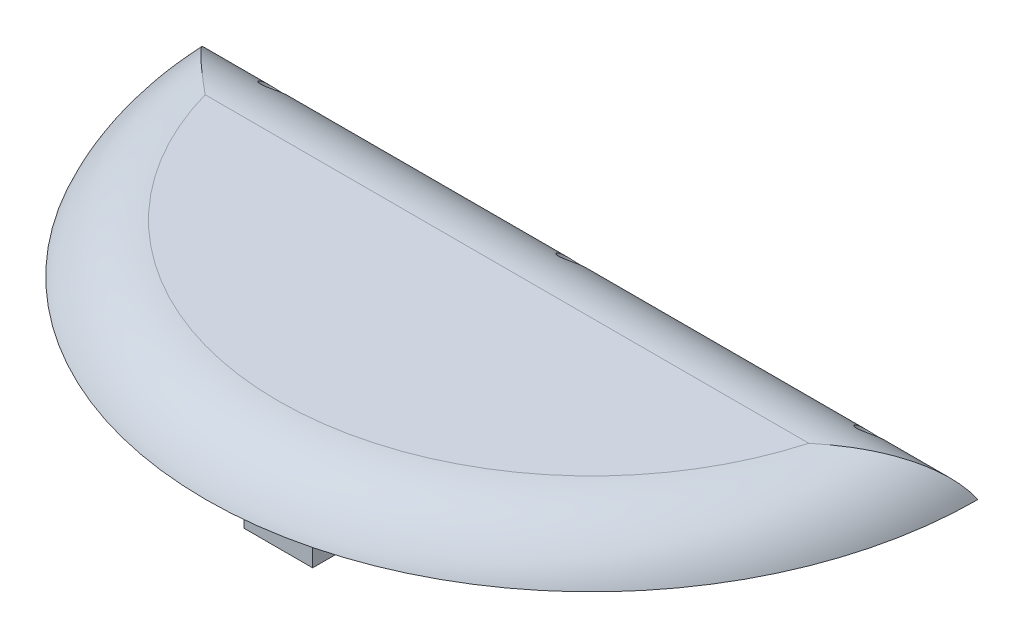
ISO-10303-21;
HEADER;
FILE_DESCRIPTION(('STEP AP214'),'2;1');
FILE_NAME('part.step','',(''),(''),'','','');
FILE_SCHEMA(('AUTOMOTIVE_DESIGN { 1 0 10303 214 1 1 1 1 }'));
ENDSEC;
DATA;
#1=APPLICATION_CONTEXT('core data for automotive mechanical design processes');
#2=APPLICATION_PROTOCOL_DEFINITION('international standard','automotive_design',2000,#1);
#3=PRODUCT_CONTEXT('',#1,'mechanical');
#4=PRODUCT('Part','Part','',(#3));
#5=PRODUCT_RELATED_PRODUCT_CATEGORY('part','',(#4));
#6=PRODUCT_DEFINITION_FORMATION('','',#4);
#7=PRODUCT_DEFINITION_CONTEXT('part definition',#1,'design');
#8=PRODUCT_DEFINITION('design','',#6,#7);
#9=PRODUCT_DEFINITION_SHAPE('','',#8);
#10=(LENGTH_UNIT() NAMED_UNIT(*) SI_UNIT(.MILLI.,.METRE.));
#11=(NAMED_UNIT(*) PLANE_ANGLE_UNIT() SI_UNIT($,.RADIAN.));
#12=(NAMED_UNIT(*) SI_UNIT($,.STERADIAN.) SOLID_ANGLE_UNIT());
#13=UNCERTAINTY_MEASURE_WITH_UNIT(LENGTH_MEASURE(1.E-05),#10,'distance_accuracy_value','');
#14=(GEOMETRIC_REPRESENTATION_CONTEXT(3) GLOBAL_UNCERTAINTY_ASSIGNED_CONTEXT((#13)) GLOBAL_UNIT_ASSIGNED_CONTEXT((#10,
#11,#12)) REPRESENTATION_CONTEXT('',''));
#15=CARTESIAN_POINT('',(0.,0.,0.));
#16=DIRECTION('',(0.,0.,1.));
#17=DIRECTION('',(1.,0.,0.));
#18=AXIS2_PLACEMENT_3D('',#15,#16,#17);
#19=CARTESIAN_POINT('',(0.,58.4278760968653,0.));
#20=DIRECTION('',(0.,1.,0.));
#21=DIRECTION('',(0.,0.,1.));
#22=AXIS2_PLACEMENT_3D('',#19,#20,#21);
#23=PLANE('',#22);
#24=DIRECTION('',(1.,0.,0.));
#25=VECTOR('',#24,1.);
#26=CARTESIAN_POINT('',(-3.5,58.4278760968653,32.));
#27=LINE('',#26,#25);
#28=CARTESIAN_POINT('',(-3.5,58.4278760968653,32.));
#29=VERTEX_POINT('',#28);
#30=CARTESIAN_POINT('',(3.5,58.4278760968653,32.));
#31=VERTEX_POINT('',#30);
#32=EDGE_CURVE('E129',#29,#31,#27,.T.);
#33=ORIENTED_EDGE('',*,*,#32,.T.);
#34=DIRECTION('',(0.,0.,-1.));
#35=VECTOR('',#34,1.);
#36=CARTESIAN_POINT('',(3.5,58.4278760968653,27.));
#37=LINE('',#36,#35);
#38=CARTESIAN_POINT('',(3.5,58.4278760968653,27.));
#39=VERTEX_POINT('',#38);
#40=EDGE_CURVE('E142',#31,#39,#37,.T.);
#41=ORIENTED_EDGE('',*,*,#40,.T.);
#42=DIRECTION('',(-1.,0.,0.));
#43=VECTOR('',#42,1.);
#44=CARTESIAN_POINT('',(-3.5,58.4278760968653,27.));
#45=LINE('',#44,#43);
#46=CARTESIAN_POINT('',(-3.5,58.4278760968653,27.));
#47=VERTEX_POINT('',#46);
#48=EDGE_CURVE('E106',#39,#47,#45,.T.);
#49=ORIENTED_EDGE('',*,*,#48,.T.);
#50=DIRECTION('',(0.,0.,1.));
#51=VECTOR('',#50,1.);
#52=CARTESIAN_POINT('',(-3.5,58.4278760968653,27.));
#53=LINE('',#52,#51);
#54=EDGE_CURVE('E133',#47,#29,#53,.T.);
#55=ORIENTED_EDGE('',*,*,#54,.T.);
#56=EDGE_LOOP('',(#33,#41,#49,#55));
#57=FACE_BOUND('',#56,.T.);
#58=CARTESIAN_POINT('',(0.,58.4278760968653,0.));
#59=DIRECTION('',(0.,1.,0.));
#60=DIRECTION('',(0.,0.,1.));
#61=AXIS2_PLACEMENT_3D('',#58,#59,#60);
#62=CIRCLE('',#61,39.4161984870957);
#63=CARTESIAN_POINT('',(39.4161984870957,58.4278760968653,0.));
#64=VERTEX_POINT('',#63);
#65=CARTESIAN_POINT('',(-39.4161984870957,58.4278760968653,2.77280175019557E-13));
#66=VERTEX_POINT('',#65);
#67=EDGE_CURVE('E179',#64,#66,#62,.F.);
#68=ORIENTED_EDGE('',*,*,#67,.T.);
#69=DIRECTION('',(-1.,0.,0.));
#70=VECTOR('',#69,1.);
#71=CARTESIAN_POINT('',(21.,58.4278760968653,0.));
#72=LINE('',#71,#70);
#73=EDGE_CURVE('E175',#64,#66,#72,.T.);
#74=ORIENTED_EDGE('',*,*,#73,.F.);
#75=EDGE_LOOP('',(#68,#74));
#76=FACE_BOUND('',#75,.T.);
#77=ADVANCED_FACE('F42',(#57,#76),#23,.F.);
#78=CARTESIAN_POINT('',(0.,60.9278760968653,15.));
#79=DIRECTION('',(0.,0.,-1.));
#80=DIRECTION('',(-1.,0.,0.));
#81=AXIS2_PLACEMENT_3D('',#78,#79,#80);
#82=PLANE('',#81);
#83=CARTESIAN_POINT('',(0.,60.9278760968653,15.));
#84=DIRECTION('',(0.,0.,-1.));
#85=DIRECTION('',(-1.,0.,0.));
#86=AXIS2_PLACEMENT_3D('',#83,#84,#85);
#87=CIRCLE('',#86,1.);
#88=CARTESIAN_POINT('',(-1.,60.9278760968653,15.));
#89=VERTEX_POINT('',#88);
#90=EDGE_CURVE('E169',#89,#89,#87,.T.);
#91=ORIENTED_EDGE('',*,*,#90,.T.);
#92=EDGE_LOOP('',(#91));
#93=FACE_BOUND('',#92,.T.);
#94=ADVANCED_FACE('F210',(#93),#82,.T.);
#95=CARTESIAN_POINT('',(-30.4161984870957,60.9278760968653,15.));
#96=DIRECTION('',(0.,0.,-1.));
#97=DIRECTION('',(-1.,0.,0.));
#98=AXIS2_PLACEMENT_3D('',#95,#96,#97);
#99=PLANE('',#98);
#100=CARTESIAN_POINT('',(-30.4161984870957,60.9278760968653,15.));
#101=DIRECTION('',(0.,0.,-1.));
#102=DIRECTION('',(-1.,0.,0.));
#103=AXIS2_PLACEMENT_3D('',#100,#101,#102);
#104=CIRCLE('',#103,0.999999999999998);
#105=CARTESIAN_POINT('',(-31.4161984870957,60.9278760968653,15.));
#106=VERTEX_POINT('',#105);
#107=EDGE_CURVE('E164',#106,#106,#104,.T.);
#108=ORIENTED_EDGE('',*,*,#107,.T.);
#109=EDGE_LOOP('',(#108));
#110=FACE_BOUND('',#109,.T.);
#111=ADVANCED_FACE('F218',(#110),#99,.T.);
#112=CARTESIAN_POINT('',(30.4161984870957,60.9278760968653,15.));
#113=DIRECTION('',(0.,0.,-1.));
#114=DIRECTION('',(-1.,0.,0.));
#115=AXIS2_PLACEMENT_3D('',#112,#113,#114);
#116=PLANE('',#115);
#117=CARTESIAN_POINT('',(30.4161984870957,60.9278760968653,15.));
#118=DIRECTION('',(0.,0.,-1.));
#119=DIRECTION('',(-1.,0.,0.));
#120=AXIS2_PLACEMENT_3D('',#117,#118,#119);
#121=CIRCLE('',#120,1.);
#122=CARTESIAN_POINT('',(29.4161984870957,60.9278760968653,15.));
#123=VERTEX_POINT('',#122);
#124=EDGE_CURVE('E158',#123,#123,#121,.T.);
#125=ORIENTED_EDGE('',*,*,#124,.T.);
#126=EDGE_LOOP('',(#125));
#127=FACE_BOUND('',#126,.T.);
#128=ADVANCED_FACE('F208',(#127),#116,.T.);
#129=CARTESIAN_POINT('',(0.,63.4278760968653,0.));
#130=DIRECTION('',(0.,1.,0.));
#131=DIRECTION('',(0.,0.,1.));
#132=AXIS2_PLACEMENT_3D('',#129,#130,#131);
#133=PLANE('',#132);
#134=CARTESIAN_POINT('',(0.,63.4278760968653,0.));
#135=DIRECTION('',(0.,-1.,0.));
#136=DIRECTION('',(0.,0.,-1.));
#137=AXIS2_PLACEMENT_3D('',#134,#135,#136);
#138=CIRCLE('',#137,32.);
#139=CARTESIAN_POINT('',(30.8058436014987,63.4278760968653,8.66025403784439));
#140=VERTEX_POINT('',#139);
#141=CARTESIAN_POINT('',(-30.8058436014987,63.4278760968653,8.66025403784439));
#142=VERTEX_POINT('',#141);
#143=EDGE_CURVE('E162',#140,#142,#138,.T.);
#144=ORIENTED_EDGE('',*,*,#143,.F.);
#145=DIRECTION('',(1.,0.,0.));
#146=VECTOR('',#145,1.);
#147=CARTESIAN_POINT('',(-32.,63.4278760968653,8.66025403784439));
#148=LINE('',#147,#146);
#149=EDGE_CURVE('E12',#140,#142,#148,.F.);
#150=ORIENTED_EDGE('',*,*,#149,.T.);
#151=EDGE_LOOP('',(#144,#150));
#152=FACE_BOUND('',#151,.T.);
#153=ADVANCED_FACE('F203',(#152),#133,.T.);
#154=CARTESIAN_POINT('',(0.,55.4278760968653,0.));
#155=DIRECTION('',(0.,-1.,0.));
#156=DIRECTION('',(0.,0.,-1.));
#157=AXIS2_PLACEMENT_3D('',#154,#155,#156);
#158=TOROIDAL_SURFACE('',#157,32.,8.);
#159=ORIENTED_EDGE('',*,*,#67,.F.);
#160=CARTESIAN_POINT('',(39.4161984870957,58.4278760968653,0.));
#161=CARTESIAN_POINT('',(39.3248627814146,58.6536788758572,0.130344024552116));
#162=CARTESIAN_POINT('',(39.2241783327426,58.8713148553678,0.267789163419811));
#163=CARTESIAN_POINT('',(39.0065442512372,59.2894743809378,0.554351169310205));
#164=CARTESIAN_POINT('',(38.8896259590301,59.4900297266587,0.703445310177015));
#165=CARTESIAN_POINT('',(38.6429242025145,59.8720485243494,1.00963458995234));
#166=CARTESIAN_POINT('',(38.5132924744738,60.0536939647382,1.16662654360266));
#167=CARTESIAN_POINT('',(38.2419126140847,60.4005824728186,1.48827079105838));
#168=CARTESIAN_POINT('',(38.1001570668415,60.5658153671947,1.65292774429866));
#169=CARTESIAN_POINT('',(37.7590783009663,60.9305417625569,2.04193843014486));
#170=CARTESIAN_POINT('',(37.5558667022851,61.1240411013678,2.26851014704271));
#171=CARTESIAN_POINT('',(37.1344091241299,61.4841461720771,2.72881696461402));
#172=CARTESIAN_POINT('',(36.9161605636529,61.6507472705665,2.96255329120809));
#173=CARTESIAN_POINT('',(36.4659147848451,61.9594027940956,3.43595156131458));
#174=CARTESIAN_POINT('',(36.2338473560937,62.101314387775,3.67563937650925));
#175=CARTESIAN_POINT('',(35.759192007343,62.3609966473796,4.15755686895182));
#176=CARTESIAN_POINT('',(35.5166038080265,62.4787666718914,4.39978661355612));
#177=CARTESIAN_POINT('',(34.9244655735319,62.7340002511076,4.98150829910124));
#178=CARTESIAN_POINT('',(34.5706892176179,62.8607175531027,5.32143192098793));
#179=CARTESIAN_POINT('',(33.849439463058,63.0739382043761,5.99945626360378));
#180=CARTESIAN_POINT('',(33.4819595838633,63.1604222595723,6.33755603303639));
#181=CARTESIAN_POINT('',(32.7370628397682,63.29641462991,7.00834774060771));
#182=CARTESIAN_POINT('',(32.3596703101725,63.3460060709482,7.34105017382659));
#183=CARTESIAN_POINT('',(31.5964719242139,63.4115141994579,7.99965299066279));
#184=CARTESIAN_POINT('',(31.210670740981,63.4274491326234,8.32555696489226));
#185=CARTESIAN_POINT('',(30.8163413047501,63.427873272919,8.65157858610253));
#186=CARTESIAN_POINT('',(30.8110927502553,63.427876094742,8.65591669707391));
#187=CARTESIAN_POINT('',(30.8058436014987,63.4278760968653,8.66025403784438));
#188=B_SPLINE_CURVE_WITH_KNOTS('',3,(#160,#161,#162,#163,#164,#165,#166,#167,#168,#169,#170,
#171,#172,#173,#174,#175,#176,#177,#178,#179,#180,#181,#182,#183,#184,#185,#186,#187),
.UNSPECIFIED.,.F.,.F.,(4,2,2,2,2,2,2,2,2,2,2,2,2,4),(0.,0.828068190173811,1.6545594046316,
2.47216990707783,3.29028408353153,4.37062580112493,5.45115341700784,6.53773793470572,
7.62435131794895,9.14239390817876,10.6611637358248,12.1765010419438,13.6910166500707,
13.7114445406601),.UNSPECIFIED.);
#189=EDGE_CURVE('E57',#64,#140,#188,.T.);
#190=ORIENTED_EDGE('',*,*,#189,.T.);
#191=ORIENTED_EDGE('',*,*,#143,.T.);
#192=CARTESIAN_POINT('',(-39.4161984870957,58.4278760968653,2.77280175019557E-13));
#193=CARTESIAN_POINT('',(-39.3248627814145,58.6536788758573,0.1303440245523));
#194=CARTESIAN_POINT('',(-39.2241783327425,58.8713148553681,0.267789163419996));
#195=CARTESIAN_POINT('',(-39.006544251237,59.2894743809382,0.554351169310471));
#196=CARTESIAN_POINT('',(-38.8896259590298,59.4900297266592,0.703445310177361));
#197=CARTESIAN_POINT('',(-38.6429242025143,59.8720485243499,1.00963458995271));
#198=CARTESIAN_POINT('',(-38.5132924744735,60.0536939647386,1.16662654360297));
#199=CARTESIAN_POINT('',(-38.2419126140845,60.4005824728188,1.48827079105857));
#200=CARTESIAN_POINT('',(-38.1001570668413,60.5658153671948,1.6529277442988));
#201=CARTESIAN_POINT('',(-37.7590783009663,60.9305417625569,2.04193843014487));
#202=CARTESIAN_POINT('',(-37.5558667022851,61.1240411013677,2.26851014704264));
#203=CARTESIAN_POINT('',(-37.1344091241301,61.484146172077,2.7288169646138));
#204=CARTESIAN_POINT('',(-36.9161605636531,61.6507472705663,2.9625532912078));
#205=CARTESIAN_POINT('',(-36.4659147848453,61.9594027940955,3.4359515613143));
#206=CARTESIAN_POINT('',(-36.2338473560938,62.1013143877749,3.67563937650906));
#207=CARTESIAN_POINT('',(-35.759192007343,62.3609966473796,4.15755686895181));
#208=CARTESIAN_POINT('',(-35.5166038080264,62.4787666718914,4.39978661355622));
#209=CARTESIAN_POINT('',(-34.9244655735316,62.7340002511076,4.98150829910138));
#210=CARTESIAN_POINT('',(-34.5706892176174,62.8607175531028,5.32143192098795));
#211=CARTESIAN_POINT('',(-33.8494394630576,63.0739382043763,5.99945626360461));
#212=CARTESIAN_POINT('',(-33.4819595838633,63.1604222595725,6.33755603303817));
#213=CARTESIAN_POINT('',(-32.7370628397664,63.2964146299101,7.00834774060758));
#214=CARTESIAN_POINT('',(-32.3596703101685,63.3460060709483,7.34105017382362));
#215=CARTESIAN_POINT('',(-31.5964719242165,63.4115141994579,7.99965299066698));
#216=CARTESIAN_POINT('',(-31.2106707409923,63.4274491326234,8.32555696490646));
#217=CARTESIAN_POINT('',(-30.8163413047504,63.427873272919,8.65157858610289));
#218=CARTESIAN_POINT('',(-30.8110927502555,63.427876094742,8.65591669707409));
#219=CARTESIAN_POINT('',(-30.8058436014987,63.4278760968653,8.66025403784439));
#220=B_SPLINE_CURVE_WITH_KNOTS('',3,(#192,#193,#194,#195,#196,#197,#198,#199,#200,#201,#202,
#203,#204,#205,#206,#207,#208,#209,#210,#211,#212,#213,#214,#215,#216,#217,#218,#219),
.UNSPECIFIED.,.F.,.F.,(4,2,2,2,2,2,2,2,2,2,2,2,2,4),(0.,0.828068190174115,1.6545594046322,
2.47216990707812,3.29028408353152,4.37062580112456,5.45115341700714,6.53773793470545,
7.62435131794899,9.14239390817916,10.6611637358262,12.1765010419447,13.6910166500705,
13.71144454066),.UNSPECIFIED.);
#221=EDGE_CURVE('E183',#142,#66,#220,.F.);
#222=ORIENTED_EDGE('',*,*,#221,.T.);
#223=EDGE_LOOP('',(#159,#190,#191,#222));
#224=FACE_BOUND('',#223,.T.);
#225=ADVANCED_FACE('F198',(#224),#158,.T.);
#226=CARTESIAN_POINT('',(0.,60.9278760968653,15.));
#227=DIRECTION('',(0.,0.,-1.));
#228=DIRECTION('',(-1.,0.,0.));
#229=AXIS2_PLACEMENT_3D('',#226,#227,#228);
#230=CYLINDRICAL_SURFACE('',#229,1.);
#231=ORIENTED_EDGE('',*,*,#90,.F.);
#232=EDGE_LOOP('',(#231));
#233=FACE_BOUND('',#232,.T.);
#234=CARTESIAN_POINT('',(0.65186975998305,60.1695451559038,1.27446374171467));
#235=CARTESIAN_POINT('',(0.618051878072622,60.1404770228833,1.24793165328114));
#236=CARTESIAN_POINT('',(0.581463062588897,60.1129614834563,1.22313227281306));
#237=CARTESIAN_POINT('',(0.502878914956767,60.0622543445392,1.17786212068647));
#238=CARTESIAN_POINT('',(0.460877505623232,60.0390676782167,1.15739628399894));
#239=CARTESIAN_POINT('',(0.371728498965981,59.9982326096898,1.12160954197757));
#240=CARTESIAN_POINT('',(0.324543286289007,59.9806288566329,1.10633004930512));
#241=CARTESIAN_POINT('',(0.226577317277097,59.9525557568499,1.08206775264967));
#242=CARTESIAN_POINT('',(0.175801151591165,59.9420774766793,1.07307706377611));
#243=CARTESIAN_POINT('',(0.0785408972326485,59.9299040372094,1.06264337295364));
#244=CARTESIAN_POINT('',(0.0322472242379022,59.9273267696662,1.0604421534141));
#245=CARTESIAN_POINT('',(-0.0601792812031219,59.9286204832038,1.06154861097389));
#246=CARTESIAN_POINT('',(-0.106312152537025,59.9324897785511,1.06485484790982));
#247=CARTESIAN_POINT('',(-0.193667439265132,59.9458847506288,1.0763479557246));
#248=CARTESIAN_POINT('',(-0.235005261385864,59.9549867759128,1.08416944228879));
#249=CARTESIAN_POINT('',(-0.315259876949168,59.9779528222321,1.10401661749484));
#250=CARTESIAN_POINT('',(-0.354176484863455,59.9918172076592,1.11604262784688));
#251=CARTESIAN_POINT('',(-0.4313283698312,60.0246445604847,1.14472690487464));
#252=CARTESIAN_POINT('',(-0.469351825327241,60.0438821352586,1.16163711262187));
#253=CARTESIAN_POINT('',(-0.54135393899682,60.0860444988562,1.19904833946562));
#254=CARTESIAN_POINT('',(-0.575330151629434,60.1089714975385,1.21955151130307));
#255=CARTESIAN_POINT('',(-0.65400435431406,60.1690958837251,1.27389750222782));
#256=CARTESIAN_POINT('',(-0.696247809427159,60.2079397490024,1.30948403871817));
#257=CARTESIAN_POINT('',(-0.771702813630424,60.2894601262198,1.38551725520722));
#258=CARTESIAN_POINT('',(-0.804894813384927,60.3321446731175,1.42597418704374));
#259=CARTESIAN_POINT('',(-0.873497660060708,60.435777593044,1.52609605662973));
#260=CARTESIAN_POINT('',(-0.905202121430917,60.4976499681149,1.58733737335749));
#261=CARTESIAN_POINT('',(-0.954551100314343,60.6223590794347,1.71422008017355));
#262=CARTESIAN_POINT('',(-0.972178269114282,60.6851969086443,1.77986679180906));
#263=CARTESIAN_POINT('',(-0.999053631514163,60.8318255396347,1.93740089464096));
#264=CARTESIAN_POINT('',(-1.00323658349312,60.9152818906902,2.03045615007416));
#265=CARTESIAN_POINT('',(-0.992014530306846,61.0782131235713,2.21913984679152));
#266=CARTESIAN_POINT('',(-0.976556699765713,61.1576766679602,2.31477454752468));
#267=CARTESIAN_POINT('',(-0.939383325931953,61.2731742055806,2.45902686295081));
#268=CARTESIAN_POINT('',(-0.924443951300008,61.311411952665,2.50772430846353));
#269=CARTESIAN_POINT('',(-0.889761121567323,61.3861596711457,2.60472261266092));
#270=CARTESIAN_POINT('',(-0.870019761439317,61.422670387723,2.65302363482041));
#271=CARTESIAN_POINT('',(-0.825653975331673,61.4935961148547,2.74859690163941));
#272=CARTESIAN_POINT('',(-0.801048596261386,61.5280186362922,2.79587238520909));
#273=CARTESIAN_POINT('',(-0.74656372416062,61.5945785000554,2.88892532835295));
#274=CARTESIAN_POINT('',(-0.716689595999789,61.626718120672,2.93470425610761));
#275=CARTESIAN_POINT('',(-0.656106529444284,61.6835027209919,3.01696347771346));
#276=CARTESIAN_POINT('',(-0.626238045005066,61.7085388351409,3.05378843874726));
#277=CARTESIAN_POINT('',(-0.561662689576076,61.7562167302755,3.12486130914156));
#278=CARTESIAN_POINT('',(-0.526947822785534,61.7788544434266,3.15910481269703));
#279=CARTESIAN_POINT('',(-0.45151454702052,61.8212061952974,3.22393852553757));
#280=CARTESIAN_POINT('',(-0.410716593047935,61.8408732297934,3.2544687552496));
#281=CARTESIAN_POINT('',(-0.322991733538644,61.875435959523,3.3086410374051));
#282=CARTESIAN_POINT('',(-0.276096295898421,61.8903548820019,3.33231656922078));
#283=CARTESIAN_POINT('',(-0.197714868199588,61.9085805254484,3.36140366381547));
#284=CARTESIAN_POINT('',(-0.168051161814474,61.9141318225382,3.37030823049796));
#285=CARTESIAN_POINT('',(-0.107396293058324,61.9225617403385,3.38385562234544));
#286=CARTESIAN_POINT('',(-0.0764066039087513,61.9254432505651,3.38850305495402));
#287=CARTESIAN_POINT('',(-0.0138089894381272,61.9282731966745,3.39306715932711));
#288=CARTESIAN_POINT('',(0.0178009536119767,61.9282095268375,3.39296430575735));
#289=CARTESIAN_POINT('',(0.0805005230535824,61.9251254113877,3.38799060558752));
#290=CARTESIAN_POINT('',(0.11158987067747,61.9221034301093,3.38311728262715));
#291=CARTESIAN_POINT('',(0.171054530563067,61.913576467642,3.36941769062346));
#292=CARTESIAN_POINT('',(0.199489070864297,61.9081845949263,3.36077160743132));
#293=CARTESIAN_POINT('',(0.254649799690047,61.8953247415686,3.34024835299218));
#294=CARTESIAN_POINT('',(0.281375338441221,61.887855976984,3.32836996171589));
#295=CARTESIAN_POINT('',(0.350704480707004,61.8654800139086,3.29299001848773));
#296=CARTESIAN_POINT('',(0.391581276767136,61.8489905415039,3.26711441983486));
#297=CARTESIAN_POINT('',(0.468191414974298,61.8125276890448,3.21059752407777));
#298=CARTESIAN_POINT('',(0.503906854973786,61.7925426904817,3.17994037194154));
#299=CARTESIAN_POINT('',(0.565561633247346,61.753261276705,3.12048578012703));
#300=CARTESIAN_POINT('',(0.592160648884947,61.7343273533827,3.09212148032529));
#301=CARTESIAN_POINT('',(0.642356074664201,61.6949458791337,3.03381646585828));
#302=CARTESIAN_POINT('',(0.66595041043025,61.674497297755,3.00387468207289));
#303=CARTESIAN_POINT('',(0.732695960417614,61.6111998355792,2.91232450280153));
#304=CARTESIAN_POINT('',(0.771762363240431,61.5664309494402,2.84903965343756));
#305=CARTESIAN_POINT('',(0.831903012638861,61.4845059715757,2.73620709897048));
#306=CARTESIAN_POINT('',(0.855039281379231,61.4481852591538,2.68710846585979));
#307=CARTESIAN_POINT('',(0.896188509392588,61.3735903432607,2.5882305981098));
#308=CARTESIAN_POINT('',(0.914199041936525,61.3353152245755,2.53845105274926));
#309=CARTESIAN_POINT('',(0.960755931422007,61.2178145219008,2.38866005258754));
#310=CARTESIAN_POINT('',(0.981807710577209,61.1359413547197,2.28823470084188));
#311=CARTESIAN_POINT('',(0.99762905720229,61.0089646492068,2.13863758548303));
#312=CARTESIAN_POINT('',(1.00024254803537,60.9656600750932,2.08863564505864));
#313=CARTESIAN_POINT('',(0.999721399690205,60.8780833535254,1.98951166098675));
#314=CARTESIAN_POINT('',(0.996585047184845,60.833810921555,1.94038988401296));
#315=CARTESIAN_POINT('',(0.977886755259317,60.7002886197261,1.79519267316583));
#316=CARTESIAN_POINT('',(0.953086329510742,60.6099788909498,1.70086740523943));
#317=CARTESIAN_POINT('',(0.890584153338471,60.4695505445626,1.5595280569628));
#318=CARTESIAN_POINT('',(0.862571637604236,60.4183728195025,1.50918440790555));
#319=CARTESIAN_POINT('',(0.795494656509535,60.3189803583937,1.41336705166031));
#320=CARTESIAN_POINT('',(0.756481139208809,60.2707531821969,1.36787219657763));
#321=CARTESIAN_POINT('',(0.692744895109765,60.2061921725379,1.30803483768128));
#322=CARTESIAN_POINT('',(0.672840064453057,60.1875701641355,1.29091616100426));
#323=CARTESIAN_POINT('',(0.65186975998305,60.1695451559038,1.27446374171467));
#324=B_SPLINE_CURVE_WITH_KNOTS('',3,(#234,#235,#236,#237,#238,#239,#240,#241,#242,#243,#244,
#245,#246,#247,#248,#249,#250,#251,#252,#253,#254,#255,#256,#257,#258,#259,#260,#261,#262,#263,
#264,#265,#266,#267,#268,#269,#270,#271,#272,#273,#274,#275,#276,#277,#278,#279,#280,#281,#282,
#283,#284,#285,#286,#287,#288,#289,#290,#291,#292,#293,#294,#295,#296,#297,#298,#299,#300,#301,
#302,#303,#304,#305,#306,#307,#308,#309,#310,#311,#312,#313,#314,#315,#316,#317,#318,#319,#320,
#321,#322,#323),.UNSPECIFIED.,.T.,.F.,(4,2,2,2,2,2,2,2,2,2,2,2,2,2,2,2,2,2,2,2,2,2,2,2,2,2,2,2,
2,2,2,2,2,2,2,2,2,2,2,2,2,2,2,2,4),(0.,0.155593881049263,0.311364008182962,0.468350198633096,
0.625139205560386,0.763635373929591,0.902095332152293,1.03066790460549,1.15925031697454,
1.29626004667574,1.43335214882101,1.63480267819108,1.8366849151741,2.11311319135971,
2.38988161151613,2.76316153244375,3.13744754650728,3.32836026645959,3.51918984541719,
3.70928645540677,3.89919060668595,4.05978527892677,4.22064811022543,4.38383677241514,
4.54621440540844,4.64024544390885,4.73417459312164,4.82848985814936,4.92285410839885,
5.01313483819819,5.1034496916883,5.25590350943609,5.40887403533496,5.53843961096793,
5.66809415687137,5.92762512043496,6.12333140779735,6.31913019681042,6.71088034589847,
6.9092555437413,7.10768986264706,7.50292866650585,7.73338983178544,7.96280073233016,
8.05928374294316),.UNSPECIFIED.);
#325=CARTESIAN_POINT('',(0.65186975998305,60.1695451559038,1.27446374171467));
#326=VERTEX_POINT('',#325);
#327=EDGE_CURVE('E47',#326,#326,#324,.T.);
#328=ORIENTED_EDGE('',*,*,#327,.T.);
#329=EDGE_LOOP('',(#328));
#330=FACE_BOUND('',#329,.T.);
#331=ADVANCED_FACE('F202',(#233,#330),#230,.F.);
#332=CARTESIAN_POINT('',(-30.4161984870957,60.9278760968653,15.));
#333=DIRECTION('',(0.,0.,-1.));
#334=DIRECTION('',(-1.,0.,0.));
#335=AXIS2_PLACEMENT_3D('',#332,#333,#334);
#336=CYLINDRICAL_SURFACE('',#335,0.999999999999998);
#337=ORIENTED_EDGE('',*,*,#107,.F.);
#338=EDGE_LOOP('',(#337));
#339=FACE_BOUND('',#338,.T.);
#340=CARTESIAN_POINT('',(-29.7643287271126,60.1695451559038,1.27446374171467));
#341=CARTESIAN_POINT('',(-29.798146609023,60.1404770228833,1.24793165328114));
#342=CARTESIAN_POINT('',(-29.8347354245068,60.1129614834563,1.22313227281306));
#343=CARTESIAN_POINT('',(-29.9133195721389,60.0622543445392,1.17786212068647));
#344=CARTESIAN_POINT('',(-29.9553209814724,60.0390676782167,1.15739628399895));
#345=CARTESIAN_POINT('',(-30.0444699881297,59.9982326096898,1.12160954197757));
#346=CARTESIAN_POINT('',(-30.0916552008067,59.9806288566329,1.10633004930512));
#347=CARTESIAN_POINT('',(-30.1896211698186,59.9525557568499,1.08206775264967));
#348=CARTESIAN_POINT('',(-30.2403973355045,59.9420774766793,1.07307706377611));
#349=CARTESIAN_POINT('',(-30.337657589863,59.9299040372094,1.06264337295365));
#350=CARTESIAN_POINT('',(-30.3839512628578,59.9273267696662,1.0604421534141));
#351=CARTESIAN_POINT('',(-30.4763777682988,59.9286204832038,1.06154861097389));
#352=CARTESIAN_POINT('',(-30.5225106396327,59.9324897785511,1.06485484790982));
#353=CARTESIAN_POINT('',(-30.6098659263608,59.9458847506288,1.0763479557246));
#354=CARTESIAN_POINT('',(-30.6512037484815,59.9549867759128,1.08416944228879));
#355=CARTESIAN_POINT('',(-30.7314583640448,59.9779528222321,1.10401661749484));
#356=CARTESIAN_POINT('',(-30.7703749719591,59.9918172076592,1.11604262784688));
#357=CARTESIAN_POINT('',(-30.8475268569269,60.0246445604847,1.14472690487463));
#358=CARTESIAN_POINT('',(-30.8855503124229,60.0438821352586,1.16163711262186));
#359=CARTESIAN_POINT('',(-30.9575524260925,60.0860444988562,1.19904833946562));
#360=CARTESIAN_POINT('',(-30.9915286387251,60.1089714975385,1.21955151130306));
#361=CARTESIAN_POINT('',(-31.0702028414097,60.1690958837251,1.27389750222782));
#362=CARTESIAN_POINT('',(-31.1124462965228,60.2079397490024,1.30948403871817));
#363=CARTESIAN_POINT('',(-31.1879013007261,60.2894601262198,1.38551725520721));
#364=CARTESIAN_POINT('',(-31.2210933004806,60.3321446731175,1.42597418704373));
#365=CARTESIAN_POINT('',(-31.2896961471564,60.435777593044,1.52609605662972));
#366=CARTESIAN_POINT('',(-31.3214006085266,60.4976499681148,1.58733737335748));
#367=CARTESIAN_POINT('',(-31.37074958741,60.6223590794347,1.71422008017353));
#368=CARTESIAN_POINT('',(-31.3883767562099,60.6851969086443,1.77986679180904));
#369=CARTESIAN_POINT('',(-31.4152521186098,60.8318255396347,1.93740089464094));
#370=CARTESIAN_POINT('',(-31.4194350705888,60.9152818906901,2.03045615007414));
#371=CARTESIAN_POINT('',(-31.4082130174025,61.0782131235713,2.2191398467915));
#372=CARTESIAN_POINT('',(-31.3927551868614,61.1576766679602,2.31477454752465));
#373=CARTESIAN_POINT('',(-31.3555818130276,61.2731742055806,2.45902686295077));
#374=CARTESIAN_POINT('',(-31.3406424383957,61.311411952665,2.50772430846349));
#375=CARTESIAN_POINT('',(-31.305959608663,61.3861596711457,2.60472261266088));
#376=CARTESIAN_POINT('',(-31.286218248535,61.422670387723,2.65302363482037));
#377=CARTESIAN_POINT('',(-31.2418524624274,61.4935961148546,2.74859690163937));
#378=CARTESIAN_POINT('',(-31.2172470833571,61.5280186362922,2.79587238520905));
#379=CARTESIAN_POINT('',(-31.1627622112563,61.5945785000553,2.88892532835292));
#380=CARTESIAN_POINT('',(-31.1328880830955,61.626718120672,2.93470425610758));
#381=CARTESIAN_POINT('',(-31.07230501654,61.6835027209919,3.01696347771343));
#382=CARTESIAN_POINT('',(-31.0424365321008,61.7085388351409,3.05378843874723));
#383=CARTESIAN_POINT('',(-30.9778611766718,61.7562167302754,3.12486130914155));
#384=CARTESIAN_POINT('',(-30.9431463098812,61.7788544434266,3.15910481269702));
#385=CARTESIAN_POINT('',(-30.8677130341162,61.8212061952973,3.22393852553756));
#386=CARTESIAN_POINT('',(-30.8269150801436,61.8408732297934,3.2544687552496));
#387=CARTESIAN_POINT('',(-30.7391902206343,61.875435959523,3.3086410374051));
#388=CARTESIAN_POINT('',(-30.6922947829941,61.8903548820019,3.33231656922078));
#389=CARTESIAN_POINT('',(-30.6139133552952,61.9085805254484,3.36140366381547));
#390=CARTESIAN_POINT('',(-30.5842496489101,61.9141318225382,3.37030823049795));
#391=CARTESIAN_POINT('',(-30.523594780154,61.9225617403385,3.38385562234543));
#392=CARTESIAN_POINT('',(-30.4926050910044,61.9254432505651,3.38850305495401));
#393=CARTESIAN_POINT('',(-30.4300074765338,61.9282731966745,3.39306715932711));
#394=CARTESIAN_POINT('',(-30.3983975334837,61.9282095268375,3.39296430575734));
#395=CARTESIAN_POINT('',(-30.3356979640421,61.9251254113877,3.38799060558752));
#396=CARTESIAN_POINT('',(-30.3046086164182,61.9221034301093,3.38311728262715));
#397=CARTESIAN_POINT('',(-30.2451439565326,61.913576467642,3.36941769062346));
#398=CARTESIAN_POINT('',(-30.2167094162314,61.9081845949263,3.36077160743131));
#399=CARTESIAN_POINT('',(-30.1615486874056,61.8953247415686,3.34024835299217));
#400=CARTESIAN_POINT('',(-30.1348231486544,61.887855976984,3.32836996171589));
#401=CARTESIAN_POINT('',(-30.0654940063887,61.8654800139086,3.29299001848772));
#402=CARTESIAN_POINT('',(-30.0246172103285,61.8489905415039,3.26711441983486));
#403=CARTESIAN_POINT('',(-29.9480070721214,61.8125276890448,3.21059752407776));
#404=CARTESIAN_POINT('',(-29.9122916321219,61.7925426904817,3.17994037194154));
#405=CARTESIAN_POINT('',(-29.8506368538483,61.753261276705,3.12048578012703));
#406=CARTESIAN_POINT('',(-29.8240378382107,61.7343273533827,3.09212148032529));
#407=CARTESIAN_POINT('',(-29.7738424124315,61.6949458791337,3.03381646585827));
#408=CARTESIAN_POINT('',(-29.7502480766654,61.674497297755,3.00387468207288));
#409=CARTESIAN_POINT('',(-29.683502526678,61.6111998355792,2.91232450280152));
#410=CARTESIAN_POINT('',(-29.6444361238552,61.5664309494402,2.84903965343755));
#411=CARTESIAN_POINT('',(-29.5842954744568,61.4845059715757,2.73620709897048));
#412=CARTESIAN_POINT('',(-29.5611592057164,61.4481852591538,2.68710846585978));
#413=CARTESIAN_POINT('',(-29.5200099777031,61.3735903432607,2.58823059810979));
#414=CARTESIAN_POINT('',(-29.5019994451591,61.3353152245755,2.53845105274925));
#415=CARTESIAN_POINT('',(-29.4554425556737,61.2178145219008,2.38866005258753));
#416=CARTESIAN_POINT('',(-29.4343907765185,61.1359413547197,2.28823470084187));
#417=CARTESIAN_POINT('',(-29.4185694298934,61.0089646492068,2.13863758548302));
#418=CARTESIAN_POINT('',(-29.4159559390603,60.9656600750932,2.08863564505863));
#419=CARTESIAN_POINT('',(-29.4164770874055,60.8780833535254,1.98951166098675));
#420=CARTESIAN_POINT('',(-29.4196134399108,60.833810921555,1.94038988401295));
#421=CARTESIAN_POINT('',(-29.4383117318364,60.7002886197261,1.79519267316582));
#422=CARTESIAN_POINT('',(-29.4631121575849,60.6099788909498,1.70086740523942));
#423=CARTESIAN_POINT('',(-29.5256143337572,60.4695505445626,1.55952805696279));
#424=CARTESIAN_POINT('',(-29.5536268494914,60.4183728195025,1.50918440790554));
#425=CARTESIAN_POINT('',(-29.6207038305861,60.3189803583936,1.41336705166031));
#426=CARTESIAN_POINT('',(-29.6597173478869,60.2707531821969,1.36787219657763));
#427=CARTESIAN_POINT('',(-29.7234535919859,60.2061921725379,1.30803483768128));
#428=CARTESIAN_POINT('',(-29.7433584226426,60.1875701641355,1.29091616100426));
#429=CARTESIAN_POINT('',(-29.7643287271126,60.1695451559038,1.27446374171467));
#430=B_SPLINE_CURVE_WITH_KNOTS('',3,(#340,#341,#342,#343,#344,#345,#346,#347,#348,#349,#350,
#351,#352,#353,#354,#355,#356,#357,#358,#359,#360,#361,#362,#363,#364,#365,#366,#367,#368,#369,
#370,#371,#372,#373,#374,#375,#376,#377,#378,#379,#380,#381,#382,#383,#384,#385,#386,#387,#388,
#389,#390,#391,#392,#393,#394,#395,#396,#397,#398,#399,#400,#401,#402,#403,#404,#405,#406,#407,
#408,#409,#410,#411,#412,#413,#414,#415,#416,#417,#418,#419,#420,#421,#422,#423,#424,#425,#426,
#427,#428,#429),.UNSPECIFIED.,.T.,.F.,(4,2,2,2,2,2,2,2,2,2,2,2,2,2,2,2,2,2,2,2,2,2,2,2,2,2,2,2,
2,2,2,2,2,2,2,2,2,2,2,2,2,2,2,2,4),(0.,0.155593881049258,0.311364008182953,0.468350198633084,
0.625139205560372,0.76363537392958,0.902095332152283,1.03066790460547,1.15925031697453,
1.29626004667573,1.43335214882099,1.63480267819106,1.83668491517408,2.11311319135968,
2.3898816115161,2.76316153244371,3.13744754650723,3.32836026645955,3.51918984541714,
3.70928645540672,3.89919060668591,4.05978527892673,4.2206481102254,4.38383677241512,
4.54621440540844,4.64024544390885,4.73417459312164,4.82848985814936,4.92285410839885,
5.01313483819818,5.10344969168829,5.25590350943608,5.40887403533495,5.53843961096793,
5.66809415687137,5.92762512043496,6.12333140779734,6.31913019681041,6.71088034589846,
6.90925554374129,7.10768986264705,7.50292866650585,7.73338983178544,7.96280073233015,
8.05928374294314),.UNSPECIFIED.);
#431=CARTESIAN_POINT('',(-29.7643287271126,60.1695451559038,1.27446374171467));
#432=VERTEX_POINT('',#431);
#433=EDGE_CURVE('E168',#432,#432,#430,.T.);
#434=ORIENTED_EDGE('',*,*,#433,.T.);
#435=EDGE_LOOP('',(#434));
#436=FACE_BOUND('',#435,.T.);
#437=ADVANCED_FACE('F222',(#339,#436),#336,.F.);
#438=CARTESIAN_POINT('',(30.4161984870957,60.9278760968653,15.));
#439=DIRECTION('',(0.,0.,-1.));
#440=DIRECTION('',(-1.,0.,0.));
#441=AXIS2_PLACEMENT_3D('',#438,#439,#440);
#442=CYLINDRICAL_SURFACE('',#441,1.);
#443=ORIENTED_EDGE('',*,*,#124,.F.);
#444=EDGE_LOOP('',(#443));
#445=FACE_BOUND('',#444,.T.);
#446=CARTESIAN_POINT('',(31.0680682470787,60.1695451559038,1.27446374171467));
#447=CARTESIAN_POINT('',(31.0342503651683,60.1404770228833,1.24793165328114));
#448=CARTESIAN_POINT('',(30.9976615496846,60.1129614834563,1.22313227281306));
#449=CARTESIAN_POINT('',(30.9190774020524,60.0622543445392,1.17786212068647));
#450=CARTESIAN_POINT('',(30.8770759927189,60.0390676782167,1.15739628399894));
#451=CARTESIAN_POINT('',(30.7879269860617,59.9982326096898,1.12160954197757));
#452=CARTESIAN_POINT('',(30.7407417733847,59.9806288566329,1.10633004930512));
#453=CARTESIAN_POINT('',(30.6427758043728,59.9525557568499,1.08206775264966));
#454=CARTESIAN_POINT('',(30.5919996386868,59.9420774766793,1.0730770637761));
#455=CARTESIAN_POINT('',(30.4947393843283,59.9299040372094,1.06264337295364));
#456=CARTESIAN_POINT('',(30.4484457113336,59.9273267696662,1.0604421534141));
#457=CARTESIAN_POINT('',(30.3560192058926,59.9286204832038,1.06154861097389));
#458=CARTESIAN_POINT('',(30.3098863345586,59.9324897785511,1.06485484790982));
#459=CARTESIAN_POINT('',(30.2225310478305,59.9458847506288,1.0763479557246));
#460=CARTESIAN_POINT('',(30.1811932257098,59.9549867759128,1.08416944228878));
#461=CARTESIAN_POINT('',(30.1009386101465,59.9779528222321,1.10401661749484));
#462=CARTESIAN_POINT('',(30.0620220022322,59.9918172076592,1.11604262784688));
#463=CARTESIAN_POINT('',(29.9848701172645,60.0246445604847,1.14472690487463));
#464=CARTESIAN_POINT('',(29.9468466617684,60.0438821352586,1.16163711262186));
#465=CARTESIAN_POINT('',(29.8748445480989,60.0860444988562,1.19904833946561));
#466=CARTESIAN_POINT('',(29.8408683354662,60.1089714975385,1.21955151130306));
#467=CARTESIAN_POINT('',(29.7621941327816,60.1690958837251,1.27389750222781));
#468=CARTESIAN_POINT('',(29.7199506776685,60.2079397490024,1.30948403871817));
#469=CARTESIAN_POINT('',(29.6444956734652,60.2894601262198,1.38551725520722));
#470=CARTESIAN_POINT('',(29.6113036737107,60.3321446731175,1.42597418704373));
#471=CARTESIAN_POINT('',(29.542700827035,60.435777593044,1.52609605662972));
#472=CARTESIAN_POINT('',(29.5109963656648,60.4976499681149,1.58733737335748));
#473=CARTESIAN_POINT('',(29.4616473867813,60.6223590794347,1.71422008017354));
#474=CARTESIAN_POINT('',(29.4440202179814,60.6851969086443,1.77986679180905));
#475=CARTESIAN_POINT('',(29.4171448555815,60.8318255396347,1.93740089464095));
#476=CARTESIAN_POINT('',(29.4129619036026,60.9152818906902,2.03045615007415));
#477=CARTESIAN_POINT('',(29.4241839567888,61.0782131235713,2.21913984679151));
#478=CARTESIAN_POINT('',(29.43964178733,61.1576766679602,2.31477454752467));
#479=CARTESIAN_POINT('',(29.4768151611637,61.2731742055806,2.45902686295079));
#480=CARTESIAN_POINT('',(29.4917545357957,61.311411952665,2.50772430846351));
#481=CARTESIAN_POINT('',(29.5264373655283,61.3861596711457,2.6047226126609));
#482=CARTESIAN_POINT('',(29.5461787256563,61.422670387723,2.65302363482038));
#483=CARTESIAN_POINT('',(29.590544511764,61.4935961148547,2.74859690163938));
#484=CARTESIAN_POINT('',(29.6151498908343,61.5280186362922,2.79587238520907));
#485=CARTESIAN_POINT('',(29.669634762935,61.5945785000553,2.88892532835293));
#486=CARTESIAN_POINT('',(29.6995088910959,61.626718120672,2.9347042561076));
#487=CARTESIAN_POINT('',(29.7600919576514,61.6835027209919,3.01696347771345));
#488=CARTESIAN_POINT('',(29.7899604420906,61.7085388351409,3.05378843874725));
#489=CARTESIAN_POINT('',(29.8545357975196,61.7562167302755,3.12486130914156));
#490=CARTESIAN_POINT('',(29.8892506643101,61.7788544434266,3.15910481269703));
#491=CARTESIAN_POINT('',(29.9646839400751,61.8212061952974,3.22393852553756));
#492=CARTESIAN_POINT('',(30.0054818940477,61.8408732297934,3.2544687552496));
#493=CARTESIAN_POINT('',(30.093206753557,61.875435959523,3.3086410374051));
#494=CARTESIAN_POINT('',(30.1401021911972,61.8903548820019,3.33231656922078));
#495=CARTESIAN_POINT('',(30.2184836188961,61.9085805254484,3.36140366381547));
#496=CARTESIAN_POINT('',(30.2481473252812,61.9141318225382,3.37030823049796));
#497=CARTESIAN_POINT('',(30.3088021940373,61.9225617403385,3.38385562234544));
#498=CARTESIAN_POINT('',(30.3397918831869,61.9254432505651,3.38850305495402));
#499=CARTESIAN_POINT('',(30.4023894976575,61.9282731966745,3.39306715932711));
#500=CARTESIAN_POINT('',(30.4339994407076,61.9282095268375,3.39296430575735));
#501=CARTESIAN_POINT('',(30.4966990101492,61.9251254113877,3.38799060558753));
#502=CARTESIAN_POINT('',(30.5277883577731,61.9221034301093,3.38311728262716));
#503=CARTESIAN_POINT('',(30.5872530176587,61.913576467642,3.36941769062346));
#504=CARTESIAN_POINT('',(30.61568755796,61.9081845949263,3.36077160743133));
#505=CARTESIAN_POINT('',(30.6708482867857,61.8953247415686,3.34024835299218));
#506=CARTESIAN_POINT('',(30.6975738255369,61.887855976984,3.3283699617159));
#507=CARTESIAN_POINT('',(30.7669029678027,61.8654800139086,3.29299001848773));
#508=CARTESIAN_POINT('',(30.8077797638628,61.8489905415039,3.26711441983487));
#509=CARTESIAN_POINT('',(30.88438990207,61.8125276890448,3.21059752407778));
#510=CARTESIAN_POINT('',(30.9201053420694,61.7925426904817,3.17994037194155));
#511=CARTESIAN_POINT('',(30.981760120343,61.753261276705,3.12048578012705));
#512=CARTESIAN_POINT('',(31.0083591359806,61.7343273533827,3.09212148032531));
#513=CARTESIAN_POINT('',(31.0585545617599,61.6949458791337,3.03381646585829));
#514=CARTESIAN_POINT('',(31.0821488975259,61.674497297755,3.00387468207291));
#515=CARTESIAN_POINT('',(31.1488944475133,61.6111998355792,2.91232450280155));
#516=CARTESIAN_POINT('',(31.1879608503361,61.5664309494402,2.84903965343758));
#517=CARTESIAN_POINT('',(31.2481014997345,61.4845059715757,2.7362070989705));
#518=CARTESIAN_POINT('',(31.2712377684749,61.4481852591538,2.68710846585981));
#519=CARTESIAN_POINT('',(31.3123869964883,61.3735903432607,2.58823059810982));
#520=CARTESIAN_POINT('',(31.3303975290322,61.3353152245755,2.53845105274928));
#521=CARTESIAN_POINT('',(31.3769544185177,61.2178145219008,2.38866005258755));
#522=CARTESIAN_POINT('',(31.3980061976729,61.1359413547197,2.2882347008419));
#523=CARTESIAN_POINT('',(31.413827544298,61.0089646492068,2.13863758548304));
#524=CARTESIAN_POINT('',(31.416441035131,60.9656600750932,2.08863564505865));
#525=CARTESIAN_POINT('',(31.4159198867859,60.8780833535254,1.98951166098677));
#526=CARTESIAN_POINT('',(31.4127835342805,60.833810921555,1.94038988401297));
#527=CARTESIAN_POINT('',(31.394085242355,60.7002886197262,1.79519267316584));
#528=CARTESIAN_POINT('',(31.3692848166064,60.6099788909498,1.70086740523944));
#529=CARTESIAN_POINT('',(31.3067826404341,60.4695505445626,1.55952805696281));
#530=CARTESIAN_POINT('',(31.2787701246999,60.4183728195025,1.50918440790556));
#531=CARTESIAN_POINT('',(31.2116931436052,60.3189803583937,1.41336705166032));
#532=CARTESIAN_POINT('',(31.1726796263045,60.2707531821969,1.36787219657764));
#533=CARTESIAN_POINT('',(31.1089433822054,60.2061921725379,1.30803483768129));
#534=CARTESIAN_POINT('',(31.0890385515487,60.1875701641355,1.29091616100426));
#535=CARTESIAN_POINT('',(31.0680682470787,60.1695451559038,1.27446374171467));
#536=B_SPLINE_CURVE_WITH_KNOTS('',3,(#446,#447,#448,#449,#450,#451,#452,#453,#454,#455,#456,
#457,#458,#459,#460,#461,#462,#463,#464,#465,#466,#467,#468,#469,#470,#471,#472,#473,#474,#475,
#476,#477,#478,#479,#480,#481,#482,#483,#484,#485,#486,#487,#488,#489,#490,#491,#492,#493,#494,
#495,#496,#497,#498,#499,#500,#501,#502,#503,#504,#505,#506,#507,#508,#509,#510,#511,#512,#513,
#514,#515,#516,#517,#518,#519,#520,#521,#522,#523,#524,#525,#526,#527,#528,#529,#530,#531,#532,
#533,#534,#535),.UNSPECIFIED.,.T.,.F.,(4,2,2,2,2,2,2,2,2,2,2,2,2,2,2,2,2,2,2,2,2,2,2,2,2,2,2,2,
2,2,2,2,2,2,2,2,2,2,2,2,2,2,2,2,4),(0.,0.155593881049262,0.311364008182958,0.46835019863309,
0.625139205560383,0.763635373929587,0.902095332152289,1.03066790460548,1.15925031697454,
1.29626004667574,1.433352148821,1.63480267819107,1.83668491517409,2.1131131913597,
2.38988161151612,2.76316153244374,3.13744754650726,3.32836026645957,3.51918984541717,
3.70928645540674,3.89919060668594,4.05978527892676,4.22064811022542,4.38383677241514,
4.54621440540845,4.64024544390885,4.73417459312164,4.82848985814936,4.92285410839885,
5.01313483819818,5.10344969168829,5.25590350943607,5.40887403533495,5.53843961096792,
5.66809415687135,5.92762512043494,6.12333140779734,6.3191301968104,6.71088034589845,
6.90925554374129,7.10768986264704,7.50292866650584,7.73338983178544,7.96280073233015,
8.05928374294317),.UNSPECIFIED.);
#537=CARTESIAN_POINT('',(31.0680682470787,60.1695451559038,1.27446374171467));
#538=VERTEX_POINT('',#537);
#539=EDGE_CURVE('E163',#538,#538,#536,.T.);
#540=ORIENTED_EDGE('',*,*,#539,.T.);
#541=EDGE_LOOP('',(#540));
#542=FACE_BOUND('',#541,.T.);
#543=ADVANCED_FACE('F212',(#445,#542),#442,.F.);
#544=CARTESIAN_POINT('',(3.5,50.4278760968653,27.));
#545=DIRECTION('',(1.,0.,0.));
#546=DIRECTION('',(0.,0.,-1.));
#547=AXIS2_PLACEMENT_3D('',#544,#545,#546);
#548=PLANE('',#547);
#549=CARTESIAN_POINT('',(3.49999999999999,54.4278760968653,29.5));
#550=DIRECTION('',(1.,0.,0.));
#551=DIRECTION('',(0.,0.,-1.));
#552=AXIS2_PLACEMENT_3D('',#549,#550,#551);
#553=CIRCLE('',#552,1.);
#554=CARTESIAN_POINT('',(3.49999999999999,54.4278760968653,28.5));
#555=VERTEX_POINT('',#554);
#556=EDGE_CURVE('E136',#555,#555,#553,.T.);
#557=ORIENTED_EDGE('',*,*,#556,.F.);
#558=EDGE_LOOP('',(#557));
#559=FACE_BOUND('',#558,.T.);
#560=ORIENTED_EDGE('',*,*,#40,.F.);
#561=DIRECTION('',(0.,1.,0.));
#562=VECTOR('',#561,1.);
#563=CARTESIAN_POINT('',(3.5,50.4278760968653,32.));
#564=LINE('',#563,#562);
#565=CARTESIAN_POINT('',(3.5,50.4278760968653,32.));
#566=VERTEX_POINT('',#565);
#567=EDGE_CURVE('E127',#566,#31,#564,.T.);
#568=ORIENTED_EDGE('',*,*,#567,.F.);
#569=DIRECTION('',(0.,0.,-1.));
#570=VECTOR('',#569,1.);
#571=CARTESIAN_POINT('',(3.5,50.4278760968653,27.));
#572=LINE('',#571,#570);
#573=CARTESIAN_POINT('',(3.5,50.4278760968653,27.));
#574=VERTEX_POINT('',#573);
#575=EDGE_CURVE('E120',#566,#574,#572,.T.);
#576=ORIENTED_EDGE('',*,*,#575,.T.);
#577=DIRECTION('',(0.,1.,0.));
#578=VECTOR('',#577,1.);
#579=CARTESIAN_POINT('',(3.5,50.4278760968653,27.));
#580=LINE('',#579,#578);
#581=EDGE_CURVE('E100',#574,#39,#580,.T.);
#582=ORIENTED_EDGE('',*,*,#581,.T.);
#583=EDGE_LOOP('',(#560,#568,#576,#582));
#584=FACE_BOUND('',#583,.T.);
#585=ADVANCED_FACE('F126',(#559,#584),#548,.T.);
#586=CARTESIAN_POINT('',(-3.5,50.4278760968653,32.));
#587=DIRECTION('',(0.,0.,1.));
#588=DIRECTION('',(1.,0.,0.));
#589=AXIS2_PLACEMENT_3D('',#586,#587,#588);
#590=PLANE('',#589);
#591=ORIENTED_EDGE('',*,*,#32,.F.);
#592=DIRECTION('',(0.,1.,0.));
#593=VECTOR('',#592,1.);
#594=CARTESIAN_POINT('',(-3.5,50.4278760968653,32.));
#595=LINE('',#594,#593);
#596=CARTESIAN_POINT('',(-3.5,50.4278760968653,32.));
#597=VERTEX_POINT('',#596);
#598=EDGE_CURVE('E153',#597,#29,#595,.T.);
#599=ORIENTED_EDGE('',*,*,#598,.F.);
#600=DIRECTION('',(1.,0.,0.));
#601=VECTOR('',#600,1.);
#602=CARTESIAN_POINT('',(-3.5,50.4278760968653,32.));
#603=LINE('',#602,#601);
#604=EDGE_CURVE('E113',#597,#566,#603,.T.);
#605=ORIENTED_EDGE('',*,*,#604,.T.);
#606=ORIENTED_EDGE('',*,*,#567,.T.);
#607=EDGE_LOOP('',(#591,#599,#605,#606));
#608=FACE_BOUND('',#607,.T.);
#609=ADVANCED_FACE('F229',(#608),#590,.T.);
#610=CARTESIAN_POINT('',(-3.5,50.4278760968653,27.));
#611=DIRECTION('',(-1.,0.,0.));
#612=DIRECTION('',(0.,0.,1.));
#613=AXIS2_PLACEMENT_3D('',#610,#611,#612);
#614=PLANE('',#613);
#615=CARTESIAN_POINT('',(-3.5,54.4278760968653,29.5));
#616=DIRECTION('',(-1.,0.,0.));
#617=DIRECTION('',(0.,0.,1.));
#618=AXIS2_PLACEMENT_3D('',#615,#616,#617);
#619=CIRCLE('',#618,1.);
#620=CARTESIAN_POINT('',(-3.5,54.4278760968653,30.5));
#621=VERTEX_POINT('',#620);
#622=EDGE_CURVE('E145',#621,#621,#619,.T.);
#623=ORIENTED_EDGE('',*,*,#622,.F.);
#624=EDGE_LOOP('',(#623));
#625=FACE_BOUND('',#624,.T.);
#626=ORIENTED_EDGE('',*,*,#54,.F.);
#627=DIRECTION('',(0.,1.,0.));
#628=VECTOR('',#627,1.);
#629=CARTESIAN_POINT('',(-3.5,50.4278760968653,27.));
#630=LINE('',#629,#628);
#631=CARTESIAN_POINT('',(-3.5,50.4278760968653,27.));
#632=VERTEX_POINT('',#631);
#633=EDGE_CURVE('E112',#632,#47,#630,.T.);
#634=ORIENTED_EDGE('',*,*,#633,.F.);
#635=DIRECTION('',(0.,0.,1.));
#636=VECTOR('',#635,1.);
#637=CARTESIAN_POINT('',(-3.5,50.4278760968653,27.));
#638=LINE('',#637,#636);
#639=EDGE_CURVE('E123',#632,#597,#638,.T.);
#640=ORIENTED_EDGE('',*,*,#639,.T.);
#641=ORIENTED_EDGE('',*,*,#598,.T.);
#642=EDGE_LOOP('',(#626,#634,#640,#641));
#643=FACE_BOUND('',#642,.T.);
#644=ADVANCED_FACE('F329',(#625,#643),#614,.T.);
#645=CARTESIAN_POINT('',(-3.5,50.4278760968653,27.));
#646=DIRECTION('',(0.,0.,-1.));
#647=DIRECTION('',(-1.,0.,0.));
#648=AXIS2_PLACEMENT_3D('',#645,#646,#647);
#649=PLANE('',#648);
#650=ORIENTED_EDGE('',*,*,#48,.F.);
#651=ORIENTED_EDGE('',*,*,#581,.F.);
#652=DIRECTION('',(-1.,0.,0.));
#653=VECTOR('',#652,1.);
#654=CARTESIAN_POINT('',(-3.5,50.4278760968653,27.));
#655=LINE('',#654,#653);
#656=EDGE_CURVE('E104',#574,#632,#655,.T.);
#657=ORIENTED_EDGE('',*,*,#656,.T.);
#658=ORIENTED_EDGE('',*,*,#633,.T.);
#659=EDGE_LOOP('',(#650,#651,#657,#658));
#660=FACE_BOUND('',#659,.T.);
#661=ADVANCED_FACE('F102',(#660),#649,.T.);
#662=CARTESIAN_POINT('',(0.,50.4278760968653,0.));
#663=DIRECTION('',(0.,1.,0.));
#664=DIRECTION('',(0.,0.,1.));
#665=AXIS2_PLACEMENT_3D('',#662,#663,#664);
#666=PLANE('',#665);
#667=ORIENTED_EDGE('',*,*,#575,.F.);
#668=ORIENTED_EDGE('',*,*,#604,.F.);
#669=ORIENTED_EDGE('',*,*,#639,.F.);
#670=ORIENTED_EDGE('',*,*,#656,.F.);
#671=EDGE_LOOP('',(#667,#668,#669,#670));
#672=FACE_BOUND('',#671,.T.);
#673=ADVANCED_FACE('F118',(#672),#666,.F.);
#674=CARTESIAN_POINT('',(-4.00000000000001,54.4278760968653,29.5));
#675=DIRECTION('',(1.,0.,0.));
#676=DIRECTION('',(0.,0.,-1.));
#677=AXIS2_PLACEMENT_3D('',#674,#675,#676);
#678=CYLINDRICAL_SURFACE('',#677,1.);
#679=ORIENTED_EDGE('',*,*,#622,.T.);
#680=EDGE_LOOP('',(#679));
#681=FACE_BOUND('',#680,.T.);
#682=ORIENTED_EDGE('',*,*,#556,.T.);
#683=EDGE_LOOP('',(#682));
#684=FACE_BOUND('',#683,.T.);
#685=ADVANCED_FACE('F256',(#681,#684),#678,.F.);
#686=CARTESIAN_POINT('',(21.,53.4278760968653,8.66025403784438));
#687=DIRECTION('',(-1.,0.,0.));
#688=DIRECTION('',(0.,0.,1.));
#689=AXIS2_PLACEMENT_3D('',#686,#687,#688);
#690=CYLINDRICAL_SURFACE('',#689,10.);
#691=ORIENTED_EDGE('',*,*,#221,.F.);
#692=ORIENTED_EDGE('',*,*,#149,.F.);
#693=ORIENTED_EDGE('',*,*,#189,.F.);
#694=ORIENTED_EDGE('',*,*,#73,.T.);
#695=EDGE_LOOP('',(#691,#692,#693,#694));
#696=FACE_BOUND('',#695,.T.);
#697=ORIENTED_EDGE('',*,*,#539,.F.);
#698=EDGE_LOOP('',(#697));
#699=FACE_BOUND('',#698,.T.);
#700=ORIENTED_EDGE('',*,*,#433,.F.);
#701=EDGE_LOOP('',(#700));
#702=FACE_BOUND('',#701,.T.);
#703=ORIENTED_EDGE('',*,*,#327,.F.);
#704=EDGE_LOOP('',(#703));
#705=FACE_BOUND('',#704,.T.);
#706=ADVANCED_FACE('F44',(#696,#699,#702,#705),#690,.T.);
#707=CLOSED_SHELL('',(#77,#94,#111,#128,#153,#225,#331,#437,#543,#585,#609,#644,#661,#673,#685,#706));
#708=MANIFOLD_SOLID_BREP('B2',#707);
#709=ADVANCED_BREP_SHAPE_REPRESENTATION('',(#18,#708),#14);
#710=SHAPE_DEFINITION_REPRESENTATION(#9,#709);
ENDSEC;
END-ISO-10303-21;
